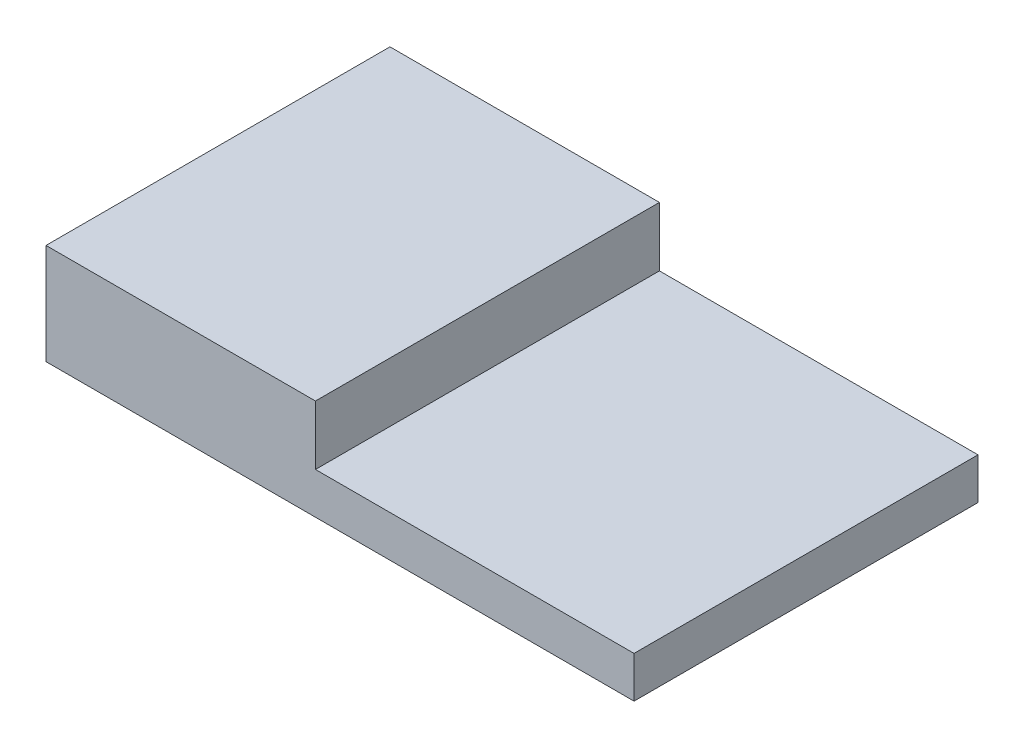
ISO-10303-21;
HEADER;
FILE_DESCRIPTION(('STEP AP214'),'2;1');
FILE_NAME('part.step','',(''),(''),'','','');
FILE_SCHEMA(('AUTOMOTIVE_DESIGN { 1 0 10303 214 1 1 1 1 }'));
ENDSEC;
DATA;
#1=APPLICATION_CONTEXT('core data for automotive mechanical design processes');
#2=APPLICATION_PROTOCOL_DEFINITION('international standard','automotive_design',2000,#1);
#3=PRODUCT_CONTEXT('',#1,'mechanical');
#4=PRODUCT('Part','Part','',(#3));
#5=PRODUCT_RELATED_PRODUCT_CATEGORY('part','',(#4));
#6=PRODUCT_DEFINITION_FORMATION('','',#4);
#7=PRODUCT_DEFINITION_CONTEXT('part definition',#1,'design');
#8=PRODUCT_DEFINITION('design','',#6,#7);
#9=PRODUCT_DEFINITION_SHAPE('','',#8);
#10=(LENGTH_UNIT() NAMED_UNIT(*) SI_UNIT(.MILLI.,.METRE.));
#11=(NAMED_UNIT(*) PLANE_ANGLE_UNIT() SI_UNIT($,.RADIAN.));
#12=(NAMED_UNIT(*) SI_UNIT($,.STERADIAN.) SOLID_ANGLE_UNIT());
#13=UNCERTAINTY_MEASURE_WITH_UNIT(LENGTH_MEASURE(1.E-05),#10,'distance_accuracy_value','');
#14=(GEOMETRIC_REPRESENTATION_CONTEXT(3) GLOBAL_UNCERTAINTY_ASSIGNED_CONTEXT((#13)) GLOBAL_UNIT_ASSIGNED_CONTEXT((#10,
#11,#12)) REPRESENTATION_CONTEXT('',''));
#15=CARTESIAN_POINT('',(0.,0.,0.));
#16=DIRECTION('',(0.,0.,1.));
#17=DIRECTION('',(1.,0.,0.));
#18=AXIS2_PLACEMENT_3D('',#15,#16,#17);
#19=CARTESIAN_POINT('',(49.74579499682,18.5857311320755,-63.5));
#20=DIRECTION('',(0.,1.,0.));
#21=DIRECTION('',(0.,0.,1.));
#22=AXIS2_PLACEMENT_3D('',#19,#20,#21);
#23=PLANE('',#22);
#24=DIRECTION('',(-1.,0.,0.));
#25=VECTOR('',#24,1.);
#26=CARTESIAN_POINT('',(49.74579499682,18.5857311320755,0.));
#27=LINE('',#26,#25);
#28=CARTESIAN_POINT('',(49.74579499682,18.5857311320755,0.));
#29=VERTEX_POINT('',#28);
#30=CARTESIAN_POINT('',(0.,18.5857311320755,0.));
#31=VERTEX_POINT('',#30);
#32=EDGE_CURVE('E117',#29,#31,#27,.T.);
#33=ORIENTED_EDGE('',*,*,#32,.F.);
#34=DIRECTION('',(0.,0.,1.));
#35=VECTOR('',#34,1.);
#36=CARTESIAN_POINT('',(49.74579499682,18.5857311320755,-63.5));
#37=LINE('',#36,#35);
#38=CARTESIAN_POINT('',(49.74579499682,18.5857311320755,-63.5));
#39=VERTEX_POINT('',#38);
#40=EDGE_CURVE('E11',#39,#29,#37,.T.);
#41=ORIENTED_EDGE('',*,*,#40,.F.);
#42=DIRECTION('',(-1.,0.,0.));
#43=VECTOR('',#42,1.);
#44=CARTESIAN_POINT('',(49.74579499682,18.5857311320755,-63.5));
#45=LINE('',#44,#43);
#46=CARTESIAN_POINT('',(0.,18.5857311320755,-63.5));
#47=VERTEX_POINT('',#46);
#48=EDGE_CURVE('E131',#39,#47,#45,.T.);
#49=ORIENTED_EDGE('',*,*,#48,.T.);
#50=DIRECTION('',(0.,0.,1.));
#51=VECTOR('',#50,1.);
#52=CARTESIAN_POINT('',(0.,18.5857311320755,-63.5));
#53=LINE('',#52,#51);
#54=EDGE_CURVE('E35',#47,#31,#53,.T.);
#55=ORIENTED_EDGE('',*,*,#54,.T.);
#56=EDGE_LOOP('',(#33,#41,#49,#55));
#57=FACE_BOUND('',#56,.T.);
#58=ADVANCED_FACE('F32',(#57),#23,.T.);
#59=CARTESIAN_POINT('',(49.74579499682,7.63797169811321,-63.5));
#60=DIRECTION('',(1.,0.,0.));
#61=DIRECTION('',(0.,0.,-1.));
#62=AXIS2_PLACEMENT_3D('',#59,#60,#61);
#63=PLANE('',#62);
#64=DIRECTION('',(0.,1.,0.));
#65=VECTOR('',#64,1.);
#66=CARTESIAN_POINT('',(49.74579499682,7.63797169811321,0.));
#67=LINE('',#66,#65);
#68=CARTESIAN_POINT('',(49.74579499682,7.63797169811321,0.));
#69=VERTEX_POINT('',#68);
#70=EDGE_CURVE('E129',#69,#29,#67,.T.);
#71=ORIENTED_EDGE('',*,*,#70,.F.);
#72=DIRECTION('',(0.,0.,1.));
#73=VECTOR('',#72,1.);
#74=CARTESIAN_POINT('',(49.74579499682,7.63797169811321,-63.5));
#75=LINE('',#74,#73);
#76=CARTESIAN_POINT('',(49.74579499682,7.63797169811321,-63.5));
#77=VERTEX_POINT('',#76);
#78=EDGE_CURVE('E41',#77,#69,#75,.T.);
#79=ORIENTED_EDGE('',*,*,#78,.F.);
#80=DIRECTION('',(0.,1.,0.));
#81=VECTOR('',#80,1.);
#82=CARTESIAN_POINT('',(49.74579499682,7.63797169811321,-63.5));
#83=LINE('',#82,#81);
#84=EDGE_CURVE('E107',#77,#39,#83,.T.);
#85=ORIENTED_EDGE('',*,*,#84,.T.);
#86=ORIENTED_EDGE('',*,*,#40,.T.);
#87=EDGE_LOOP('',(#71,#79,#85,#86));
#88=FACE_BOUND('',#87,.T.);
#89=ADVANCED_FACE('F139',(#88),#63,.T.);
#90=CARTESIAN_POINT('',(108.558177072292,7.63797169811321,-63.5));
#91=DIRECTION('',(0.,1.,0.));
#92=DIRECTION('',(0.,0.,1.));
#93=AXIS2_PLACEMENT_3D('',#90,#91,#92);
#94=PLANE('',#93);
#95=DIRECTION('',(-1.,0.,0.));
#96=VECTOR('',#95,1.);
#97=CARTESIAN_POINT('',(108.558177072292,7.63797169811321,0.));
#98=LINE('',#97,#96);
#99=CARTESIAN_POINT('',(108.558177072292,7.63797169811321,0.));
#100=VERTEX_POINT('',#99);
#101=EDGE_CURVE('E94',#100,#69,#98,.T.);
#102=ORIENTED_EDGE('',*,*,#101,.F.);
#103=DIRECTION('',(0.,0.,1.));
#104=VECTOR('',#103,1.);
#105=CARTESIAN_POINT('',(108.558177072292,7.63797169811321,-63.5));
#106=LINE('',#105,#104);
#107=CARTESIAN_POINT('',(108.558177072292,7.63797169811321,-63.5));
#108=VERTEX_POINT('',#107);
#109=EDGE_CURVE('E89',#108,#100,#106,.T.);
#110=ORIENTED_EDGE('',*,*,#109,.F.);
#111=DIRECTION('',(-1.,0.,0.));
#112=VECTOR('',#111,1.);
#113=CARTESIAN_POINT('',(108.558177072292,7.63797169811321,-63.5));
#114=LINE('',#113,#112);
#115=EDGE_CURVE('E92',#108,#77,#114,.T.);
#116=ORIENTED_EDGE('',*,*,#115,.T.);
#117=ORIENTED_EDGE('',*,*,#78,.T.);
#118=EDGE_LOOP('',(#102,#110,#116,#117));
#119=FACE_BOUND('',#118,.T.);
#120=ADVANCED_FACE('F91',(#119),#94,.T.);
#121=CARTESIAN_POINT('',(108.558177072292,0.,-63.5));
#122=DIRECTION('',(1.,0.,0.));
#123=DIRECTION('',(0.,0.,-1.));
#124=AXIS2_PLACEMENT_3D('',#121,#122,#123);
#125=PLANE('',#124);
#126=DIRECTION('',(0.,1.,0.));
#127=VECTOR('',#126,1.);
#128=CARTESIAN_POINT('',(108.558177072292,0.,0.));
#129=LINE('',#128,#127);
#130=CARTESIAN_POINT('',(108.558177072292,0.,0.));
#131=VERTEX_POINT('',#130);
#132=EDGE_CURVE('E126',#131,#100,#129,.T.);
#133=ORIENTED_EDGE('',*,*,#132,.F.);
#134=DIRECTION('',(0.,0.,1.));
#135=VECTOR('',#134,1.);
#136=CARTESIAN_POINT('',(108.558177072292,0.,-63.5));
#137=LINE('',#136,#135);
#138=CARTESIAN_POINT('',(108.558177072292,0.,-63.5));
#139=VERTEX_POINT('',#138);
#140=EDGE_CURVE('E99',#139,#131,#137,.T.);
#141=ORIENTED_EDGE('',*,*,#140,.F.);
#142=DIRECTION('',(0.,1.,0.));
#143=VECTOR('',#142,1.);
#144=CARTESIAN_POINT('',(108.558177072292,0.,-63.5));
#145=LINE('',#144,#143);
#146=EDGE_CURVE('E105',#139,#108,#145,.T.);
#147=ORIENTED_EDGE('',*,*,#146,.T.);
#148=ORIENTED_EDGE('',*,*,#109,.T.);
#149=EDGE_LOOP('',(#133,#141,#147,#148));
#150=FACE_BOUND('',#149,.T.);
#151=ADVANCED_FACE('F109',(#150),#125,.T.);
#152=CARTESIAN_POINT('',(0.,0.,-63.5));
#153=DIRECTION('',(0.,-1.,0.));
#154=DIRECTION('',(0.,0.,-1.));
#155=AXIS2_PLACEMENT_3D('',#152,#153,#154);
#156=PLANE('',#155);
#157=DIRECTION('',(1.,0.,0.));
#158=VECTOR('',#157,1.);
#159=CARTESIAN_POINT('',(0.,0.,0.));
#160=LINE('',#159,#158);
#161=CARTESIAN_POINT('',(0.,0.,0.));
#162=VERTEX_POINT('',#161);
#163=EDGE_CURVE('E123',#162,#131,#160,.T.);
#164=ORIENTED_EDGE('',*,*,#163,.F.);
#165=DIRECTION('',(0.,0.,1.));
#166=VECTOR('',#165,1.);
#167=CARTESIAN_POINT('',(0.,0.,-63.5));
#168=LINE('',#167,#166);
#169=CARTESIAN_POINT('',(0.,0.,-63.5));
#170=VERTEX_POINT('',#169);
#171=EDGE_CURVE('E134',#170,#162,#168,.T.);
#172=ORIENTED_EDGE('',*,*,#171,.F.);
#173=DIRECTION('',(1.,0.,0.));
#174=VECTOR('',#173,1.);
#175=CARTESIAN_POINT('',(0.,0.,-63.5));
#176=LINE('',#175,#174);
#177=EDGE_CURVE('E110',#170,#139,#176,.T.);
#178=ORIENTED_EDGE('',*,*,#177,.T.);
#179=ORIENTED_EDGE('',*,*,#140,.T.);
#180=EDGE_LOOP('',(#164,#172,#178,#179));
#181=FACE_BOUND('',#180,.T.);
#182=ADVANCED_FACE('F152',(#181),#156,.T.);
#183=CARTESIAN_POINT('',(0.,18.5857311320755,-63.5));
#184=DIRECTION('',(-1.,0.,0.));
#185=DIRECTION('',(0.,0.,1.));
#186=AXIS2_PLACEMENT_3D('',#183,#184,#185);
#187=PLANE('',#186);
#188=DIRECTION('',(0.,-1.,0.));
#189=VECTOR('',#188,1.);
#190=CARTESIAN_POINT('',(0.,18.5857311320755,0.));
#191=LINE('',#190,#189);
#192=EDGE_CURVE('E120',#31,#162,#191,.T.);
#193=ORIENTED_EDGE('',*,*,#192,.F.);
#194=ORIENTED_EDGE('',*,*,#54,.F.);
#195=DIRECTION('',(0.,-1.,0.));
#196=VECTOR('',#195,1.);
#197=CARTESIAN_POINT('',(0.,18.5857311320755,-63.5));
#198=LINE('',#197,#196);
#199=EDGE_CURVE('E112',#47,#170,#198,.T.);
#200=ORIENTED_EDGE('',*,*,#199,.T.);
#201=ORIENTED_EDGE('',*,*,#171,.T.);
#202=EDGE_LOOP('',(#193,#194,#200,#201));
#203=FACE_BOUND('',#202,.T.);
#204=ADVANCED_FACE('F136',(#203),#187,.T.);
#205=CARTESIAN_POINT('',(0.,18.5857311320755,-63.5));
#206=DIRECTION('',(0.,0.,1.));
#207=DIRECTION('',(1.,0.,0.));
#208=AXIS2_PLACEMENT_3D('',#205,#206,#207);
#209=PLANE('',#208);
#210=ORIENTED_EDGE('',*,*,#48,.F.);
#211=ORIENTED_EDGE('',*,*,#84,.F.);
#212=ORIENTED_EDGE('',*,*,#115,.F.);
#213=ORIENTED_EDGE('',*,*,#146,.F.);
#214=ORIENTED_EDGE('',*,*,#177,.F.);
#215=ORIENTED_EDGE('',*,*,#199,.F.);
#216=EDGE_LOOP('',(#210,#211,#212,#213,#214,#215));
#217=FACE_BOUND('',#216,.T.);
#218=ADVANCED_FACE('F103',(#217),#209,.F.);
#219=CARTESIAN_POINT('',(0.,18.5857311320755,0.));
#220=DIRECTION('',(0.,0.,1.));
#221=DIRECTION('',(1.,0.,0.));
#222=AXIS2_PLACEMENT_3D('',#219,#220,#221);
#223=PLANE('',#222);
#224=ORIENTED_EDGE('',*,*,#32,.T.);
#225=ORIENTED_EDGE('',*,*,#192,.T.);
#226=ORIENTED_EDGE('',*,*,#163,.T.);
#227=ORIENTED_EDGE('',*,*,#132,.T.);
#228=ORIENTED_EDGE('',*,*,#101,.T.);
#229=ORIENTED_EDGE('',*,*,#70,.T.);
#230=EDGE_LOOP('',(#224,#225,#226,#227,#228,#229));
#231=FACE_BOUND('',#230,.T.);
#232=ADVANCED_FACE('F138',(#231),#223,.T.);
#233=CLOSED_SHELL('',(#58,#89,#120,#151,#182,#204,#218,#232));
#234=MANIFOLD_SOLID_BREP('B2',#233);
#235=ADVANCED_BREP_SHAPE_REPRESENTATION('',(#18,#234),#14);
#236=SHAPE_DEFINITION_REPRESENTATION(#9,#235);
ENDSEC;
END-ISO-10303-21;
